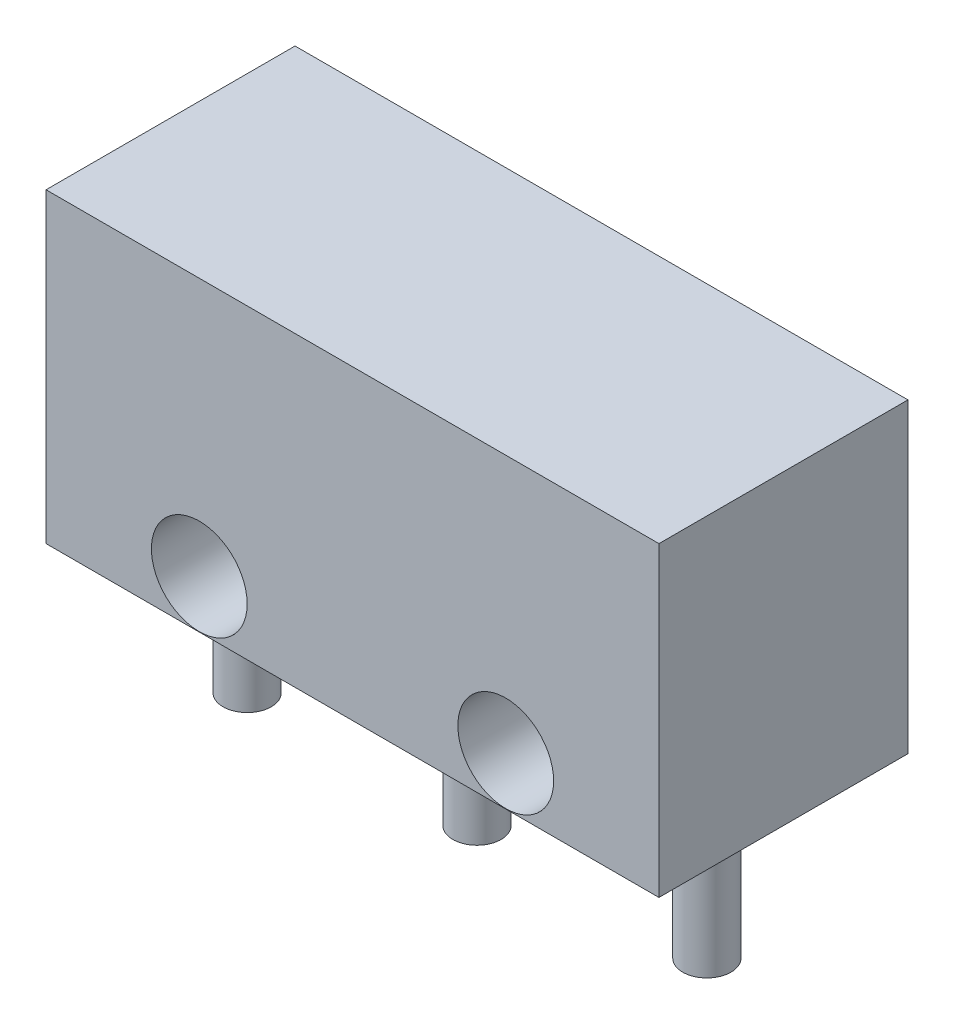
ISO-10303-21;
HEADER;
FILE_DESCRIPTION(('STEP AP214'),'2;1');
FILE_NAME('part.step','',(''),(''),'','','');
FILE_SCHEMA(('AUTOMOTIVE_DESIGN { 1 0 10303 214 1 1 1 1 }'));
ENDSEC;
DATA;
#1=APPLICATION_CONTEXT('core data for automotive mechanical design processes');
#2=APPLICATION_PROTOCOL_DEFINITION('international standard','automotive_design',2000,#1);
#3=PRODUCT_CONTEXT('',#1,'mechanical');
#4=PRODUCT('Part','Part','',(#3));
#5=PRODUCT_RELATED_PRODUCT_CATEGORY('part','',(#4));
#6=PRODUCT_DEFINITION_FORMATION('','',#4);
#7=PRODUCT_DEFINITION_CONTEXT('part definition',#1,'design');
#8=PRODUCT_DEFINITION('design','',#6,#7);
#9=PRODUCT_DEFINITION_SHAPE('','',#8);
#10=(LENGTH_UNIT() NAMED_UNIT(*) SI_UNIT(.MILLI.,.METRE.));
#11=(NAMED_UNIT(*) PLANE_ANGLE_UNIT() SI_UNIT($,.RADIAN.));
#12=(NAMED_UNIT(*) SI_UNIT($,.STERADIAN.) SOLID_ANGLE_UNIT());
#13=UNCERTAINTY_MEASURE_WITH_UNIT(LENGTH_MEASURE(1.E-05),#10,'distance_accuracy_value','');
#14=(GEOMETRIC_REPRESENTATION_CONTEXT(3) GLOBAL_UNCERTAINTY_ASSIGNED_CONTEXT((#13)) GLOBAL_UNIT_ASSIGNED_CONTEXT((#10,
#11,#12)) REPRESENTATION_CONTEXT('',''));
#15=CARTESIAN_POINT('',(0.,0.,0.));
#16=DIRECTION('',(0.,0.,1.));
#17=DIRECTION('',(1.,0.,0.));
#18=AXIS2_PLACEMENT_3D('',#15,#16,#17);
#19=CARTESIAN_POINT('',(0.,6.35,0.));
#20=DIRECTION('',(1.,0.,0.));
#21=DIRECTION('',(0.,0.,-1.));
#22=AXIS2_PLACEMENT_3D('',#19,#20,#21);
#23=PLANE('',#22);
#24=DIRECTION('',(0.,0.,1.));
#25=VECTOR('',#24,1.);
#26=CARTESIAN_POINT('',(0.,0.,0.));
#27=LINE('',#26,#25);
#28=CARTESIAN_POINT('',(0.,0.,-5.159375));
#29=VERTEX_POINT('',#28);
#30=CARTESIAN_POINT('',(0.,0.,0.));
#31=VERTEX_POINT('',#30);
#32=EDGE_CURVE('E96',#29,#31,#27,.T.);
#33=ORIENTED_EDGE('',*,*,#32,.T.);
#34=DIRECTION('',(0.,-1.,0.));
#35=VECTOR('',#34,1.);
#36=CARTESIAN_POINT('',(0.,6.35,0.));
#37=LINE('',#36,#35);
#38=CARTESIAN_POINT('',(0.,6.35,0.));
#39=VERTEX_POINT('',#38);
#40=EDGE_CURVE('E11',#39,#31,#37,.T.);
#41=ORIENTED_EDGE('',*,*,#40,.F.);
#42=DIRECTION('',(0.,0.,1.));
#43=VECTOR('',#42,1.);
#44=CARTESIAN_POINT('',(0.,6.35,0.));
#45=LINE('',#44,#43);
#46=CARTESIAN_POINT('',(0.,6.35,-5.159375));
#47=VERTEX_POINT('',#46);
#48=EDGE_CURVE('E84',#47,#39,#45,.T.);
#49=ORIENTED_EDGE('',*,*,#48,.F.);
#50=DIRECTION('',(0.,-1.,0.));
#51=VECTOR('',#50,1.);
#52=CARTESIAN_POINT('',(0.,6.35,-5.159375));
#53=LINE('',#52,#51);
#54=EDGE_CURVE('E92',#47,#29,#53,.T.);
#55=ORIENTED_EDGE('',*,*,#54,.T.);
#56=EDGE_LOOP('',(#33,#41,#49,#55));
#57=FACE_BOUND('',#56,.T.);
#58=ADVANCED_FACE('F33',(#57),#23,.F.);
#59=CARTESIAN_POINT('',(0.,6.35,0.));
#60=DIRECTION('',(0.,0.,-1.));
#61=DIRECTION('',(-1.,0.,0.));
#62=AXIS2_PLACEMENT_3D('',#59,#60,#61);
#63=PLANE('',#62);
#64=CARTESIAN_POINT('',(3.175,1.,0.));
#65=DIRECTION('',(0.,0.,1.));
#66=DIRECTION('',(1.,0.,0.));
#67=AXIS2_PLACEMENT_3D('',#64,#65,#66);
#68=CIRCLE('',#67,0.9921875);
#69=CARTESIAN_POINT('',(4.1671875,1.,0.));
#70=VERTEX_POINT('',#69);
#71=EDGE_CURVE('E134',#70,#70,#68,.T.);
#72=ORIENTED_EDGE('',*,*,#71,.F.);
#73=EDGE_LOOP('',(#72));
#74=FACE_BOUND('',#73,.T.);
#75=CARTESIAN_POINT('',(9.525,1.,0.));
#76=DIRECTION('',(0.,0.,1.));
#77=DIRECTION('',(1.,0.,0.));
#78=AXIS2_PLACEMENT_3D('',#75,#76,#77);
#79=CIRCLE('',#78,0.992187499999999);
#80=CARTESIAN_POINT('',(10.5171875,1.,0.));
#81=VERTEX_POINT('',#80);
#82=EDGE_CURVE('E128',#81,#81,#79,.T.);
#83=ORIENTED_EDGE('',*,*,#82,.F.);
#84=EDGE_LOOP('',(#83));
#85=FACE_BOUND('',#84,.T.);
#86=DIRECTION('',(1.,0.,0.));
#87=VECTOR('',#86,1.);
#88=CARTESIAN_POINT('',(0.,0.,0.));
#89=LINE('',#88,#87);
#90=CARTESIAN_POINT('',(12.7,0.,0.));
#91=VERTEX_POINT('',#90);
#92=EDGE_CURVE('E88',#31,#91,#89,.T.);
#93=ORIENTED_EDGE('',*,*,#92,.T.);
#94=DIRECTION('',(0.,-1.,0.));
#95=VECTOR('',#94,1.);
#96=CARTESIAN_POINT('',(12.7,6.35,0.));
#97=LINE('',#96,#95);
#98=CARTESIAN_POINT('',(12.7,6.35,0.));
#99=VERTEX_POINT('',#98);
#100=EDGE_CURVE('E41',#99,#91,#97,.T.);
#101=ORIENTED_EDGE('',*,*,#100,.F.);
#102=DIRECTION('',(1.,0.,0.));
#103=VECTOR('',#102,1.);
#104=CARTESIAN_POINT('',(0.,6.35,0.));
#105=LINE('',#104,#103);
#106=EDGE_CURVE('E79',#39,#99,#105,.T.);
#107=ORIENTED_EDGE('',*,*,#106,.F.);
#108=ORIENTED_EDGE('',*,*,#40,.T.);
#109=EDGE_LOOP('',(#93,#101,#107,#108));
#110=FACE_BOUND('',#109,.T.);
#111=ADVANCED_FACE('F87',(#74,#85,#110),#63,.F.);
#112=CARTESIAN_POINT('',(12.7,6.35,0.));
#113=DIRECTION('',(-1.,0.,0.));
#114=DIRECTION('',(0.,0.,1.));
#115=AXIS2_PLACEMENT_3D('',#112,#113,#114);
#116=PLANE('',#115);
#117=DIRECTION('',(0.,0.,-1.));
#118=VECTOR('',#117,1.);
#119=CARTESIAN_POINT('',(12.7,0.,0.));
#120=LINE('',#119,#118);
#121=CARTESIAN_POINT('',(12.7,0.,-5.159375));
#122=VERTEX_POINT('',#121);
#123=EDGE_CURVE('E66',#91,#122,#120,.T.);
#124=ORIENTED_EDGE('',*,*,#123,.T.);
#125=DIRECTION('',(0.,-1.,0.));
#126=VECTOR('',#125,1.);
#127=CARTESIAN_POINT('',(12.7,6.35,-5.159375));
#128=LINE('',#127,#126);
#129=CARTESIAN_POINT('',(12.7,6.35,-5.159375));
#130=VERTEX_POINT('',#129);
#131=EDGE_CURVE('E89',#130,#122,#128,.T.);
#132=ORIENTED_EDGE('',*,*,#131,.F.);
#133=DIRECTION('',(0.,0.,-1.));
#134=VECTOR('',#133,1.);
#135=CARTESIAN_POINT('',(12.7,6.35,0.));
#136=LINE('',#135,#134);
#137=EDGE_CURVE('E82',#99,#130,#136,.T.);
#138=ORIENTED_EDGE('',*,*,#137,.F.);
#139=ORIENTED_EDGE('',*,*,#100,.T.);
#140=EDGE_LOOP('',(#124,#132,#138,#139));
#141=FACE_BOUND('',#140,.T.);
#142=ADVANCED_FACE('F90',(#141),#116,.F.);
#143=CARTESIAN_POINT('',(0.,6.35,-5.159375));
#144=DIRECTION('',(0.,0.,1.));
#145=DIRECTION('',(1.,0.,0.));
#146=AXIS2_PLACEMENT_3D('',#143,#144,#145);
#147=PLANE('',#146);
#148=CARTESIAN_POINT('',(3.175,1.,-5.159375));
#149=DIRECTION('',(0.,0.,1.));
#150=DIRECTION('',(1.,0.,0.));
#151=AXIS2_PLACEMENT_3D('',#148,#149,#150);
#152=CIRCLE('',#151,0.9921875);
#153=CARTESIAN_POINT('',(4.1671875,1.,-5.159375));
#154=VERTEX_POINT('',#153);
#155=EDGE_CURVE('E131',#154,#154,#152,.T.);
#156=ORIENTED_EDGE('',*,*,#155,.T.);
#157=EDGE_LOOP('',(#156));
#158=FACE_BOUND('',#157,.T.);
#159=CARTESIAN_POINT('',(9.525,1.,-5.159375));
#160=DIRECTION('',(0.,0.,1.));
#161=DIRECTION('',(1.,0.,0.));
#162=AXIS2_PLACEMENT_3D('',#159,#160,#161);
#163=CIRCLE('',#162,0.992187499999999);
#164=CARTESIAN_POINT('',(10.5171875,1.,-5.159375));
#165=VERTEX_POINT('',#164);
#166=EDGE_CURVE('E125',#165,#165,#163,.T.);
#167=ORIENTED_EDGE('',*,*,#166,.T.);
#168=EDGE_LOOP('',(#167));
#169=FACE_BOUND('',#168,.T.);
#170=DIRECTION('',(-1.,0.,0.));
#171=VECTOR('',#170,1.);
#172=CARTESIAN_POINT('',(0.,0.,-5.159375));
#173=LINE('',#172,#171);
#174=EDGE_CURVE('E72',#122,#29,#173,.T.);
#175=ORIENTED_EDGE('',*,*,#174,.T.);
#176=ORIENTED_EDGE('',*,*,#54,.F.);
#177=DIRECTION('',(-1.,0.,0.));
#178=VECTOR('',#177,1.);
#179=CARTESIAN_POINT('',(0.,6.35,-5.159375));
#180=LINE('',#179,#178);
#181=EDGE_CURVE('E49',#130,#47,#180,.T.);
#182=ORIENTED_EDGE('',*,*,#181,.F.);
#183=ORIENTED_EDGE('',*,*,#131,.T.);
#184=EDGE_LOOP('',(#175,#176,#182,#183));
#185=FACE_BOUND('',#184,.T.);
#186=ADVANCED_FACE('F104',(#158,#169,#185),#147,.F.);
#187=CARTESIAN_POINT('',(0.,6.35,0.));
#188=DIRECTION('',(0.,-1.,0.));
#189=DIRECTION('',(0.,0.,-1.));
#190=AXIS2_PLACEMENT_3D('',#187,#188,#189);
#191=PLANE('',#190);
#192=ORIENTED_EDGE('',*,*,#48,.T.);
#193=ORIENTED_EDGE('',*,*,#106,.T.);
#194=ORIENTED_EDGE('',*,*,#137,.T.);
#195=ORIENTED_EDGE('',*,*,#181,.T.);
#196=EDGE_LOOP('',(#192,#193,#194,#195));
#197=FACE_BOUND('',#196,.T.);
#198=ADVANCED_FACE('F80',(#197),#191,.F.);
#199=CARTESIAN_POINT('',(0.,0.,0.));
#200=DIRECTION('',(0.,-1.,0.));
#201=DIRECTION('',(0.,0.,-1.));
#202=AXIS2_PLACEMENT_3D('',#199,#200,#201);
#203=PLANE('',#202);
#204=CARTESIAN_POINT('',(11.1125,0.,-2.5796875));
#205=DIRECTION('',(0.,-1.,0.));
#206=DIRECTION('',(0.,0.,-1.));
#207=AXIS2_PLACEMENT_3D('',#204,#205,#206);
#208=CIRCLE('',#207,0.500000000000001);
#209=CARTESIAN_POINT('',(11.1125,0.,-3.0796875));
#210=VERTEX_POINT('',#209);
#211=EDGE_CURVE('E122',#210,#210,#208,.T.);
#212=ORIENTED_EDGE('',*,*,#211,.F.);
#213=EDGE_LOOP('',(#212));
#214=FACE_BOUND('',#213,.T.);
#215=CARTESIAN_POINT('',(1.5875,0.,-2.5796875));
#216=DIRECTION('',(0.,-1.,0.));
#217=DIRECTION('',(0.,0.,-1.));
#218=AXIS2_PLACEMENT_3D('',#215,#216,#217);
#219=CIRCLE('',#218,0.5);
#220=CARTESIAN_POINT('',(1.5875,0.,-3.0796875));
#221=VERTEX_POINT('',#220);
#222=EDGE_CURVE('E116',#221,#221,#219,.T.);
#223=ORIENTED_EDGE('',*,*,#222,.F.);
#224=EDGE_LOOP('',(#223));
#225=FACE_BOUND('',#224,.T.);
#226=CARTESIAN_POINT('',(6.35,0.,-2.5796875));
#227=DIRECTION('',(0.,-1.,0.));
#228=DIRECTION('',(0.,0.,-1.));
#229=AXIS2_PLACEMENT_3D('',#226,#227,#228);
#230=CIRCLE('',#229,0.500000000000001);
#231=CARTESIAN_POINT('',(6.35,0.,-3.0796875));
#232=VERTEX_POINT('',#231);
#233=EDGE_CURVE('E110',#232,#232,#230,.T.);
#234=ORIENTED_EDGE('',*,*,#233,.F.);
#235=EDGE_LOOP('',(#234));
#236=FACE_BOUND('',#235,.T.);
#237=ORIENTED_EDGE('',*,*,#32,.F.);
#238=ORIENTED_EDGE('',*,*,#174,.F.);
#239=ORIENTED_EDGE('',*,*,#123,.F.);
#240=ORIENTED_EDGE('',*,*,#92,.F.);
#241=EDGE_LOOP('',(#237,#238,#239,#240));
#242=FACE_BOUND('',#241,.T.);
#243=ADVANCED_FACE('F107',(#214,#225,#236,#242),#203,.T.);
#244=CARTESIAN_POINT('',(6.35,-3.175,-2.5796875));
#245=DIRECTION('',(0.,1.,0.));
#246=DIRECTION('',(0.,0.,1.));
#247=AXIS2_PLACEMENT_3D('',#244,#245,#246);
#248=CYLINDRICAL_SURFACE('',#247,0.500000000000001);
#249=CARTESIAN_POINT('',(6.35,-3.175,-2.5796875));
#250=DIRECTION('',(0.,-1.,0.));
#251=DIRECTION('',(0.,0.,-1.));
#252=AXIS2_PLACEMENT_3D('',#249,#250,#251);
#253=CIRCLE('',#252,0.500000000000001);
#254=CARTESIAN_POINT('',(6.35,-3.175,-3.0796875));
#255=VERTEX_POINT('',#254);
#256=EDGE_CURVE('E99',#255,#255,#253,.T.);
#257=ORIENTED_EDGE('',*,*,#256,.F.);
#258=EDGE_LOOP('',(#257));
#259=FACE_BOUND('',#258,.T.);
#260=ORIENTED_EDGE('',*,*,#233,.T.);
#261=EDGE_LOOP('',(#260));
#262=FACE_BOUND('',#261,.T.);
#263=ADVANCED_FACE('F196',(#259,#262),#248,.T.);
#264=CARTESIAN_POINT('',(6.35,-3.175,-2.5796875));
#265=DIRECTION('',(0.,-1.,0.));
#266=DIRECTION('',(0.,0.,-1.));
#267=AXIS2_PLACEMENT_3D('',#264,#265,#266);
#268=PLANE('',#267);
#269=ORIENTED_EDGE('',*,*,#256,.T.);
#270=EDGE_LOOP('',(#269));
#271=FACE_BOUND('',#270,.T.);
#272=ADVANCED_FACE('F204',(#271),#268,.T.);
#273=CARTESIAN_POINT('',(1.5875,-3.175,-2.5796875));
#274=DIRECTION('',(0.,1.,0.));
#275=DIRECTION('',(0.,0.,1.));
#276=AXIS2_PLACEMENT_3D('',#273,#274,#275);
#277=CYLINDRICAL_SURFACE('',#276,0.5);
#278=CARTESIAN_POINT('',(1.5875,-3.175,-2.5796875));
#279=DIRECTION('',(0.,-1.,0.));
#280=DIRECTION('',(0.,0.,-1.));
#281=AXIS2_PLACEMENT_3D('',#278,#279,#280);
#282=CIRCLE('',#281,0.5);
#283=CARTESIAN_POINT('',(1.5875,-3.175,-3.0796875));
#284=VERTEX_POINT('',#283);
#285=EDGE_CURVE('E113',#284,#284,#282,.T.);
#286=ORIENTED_EDGE('',*,*,#285,.F.);
#287=EDGE_LOOP('',(#286));
#288=FACE_BOUND('',#287,.T.);
#289=ORIENTED_EDGE('',*,*,#222,.T.);
#290=EDGE_LOOP('',(#289));
#291=FACE_BOUND('',#290,.T.);
#292=ADVANCED_FACE('F212',(#288,#291),#277,.T.);
#293=CARTESIAN_POINT('',(1.5875,-3.175,-2.5796875));
#294=DIRECTION('',(0.,-1.,0.));
#295=DIRECTION('',(0.,0.,-1.));
#296=AXIS2_PLACEMENT_3D('',#293,#294,#295);
#297=PLANE('',#296);
#298=ORIENTED_EDGE('',*,*,#285,.T.);
#299=EDGE_LOOP('',(#298));
#300=FACE_BOUND('',#299,.T.);
#301=ADVANCED_FACE('F220',(#300),#297,.T.);
#302=CARTESIAN_POINT('',(11.1125,-3.175,-2.5796875));
#303=DIRECTION('',(0.,1.,0.));
#304=DIRECTION('',(0.,0.,1.));
#305=AXIS2_PLACEMENT_3D('',#302,#303,#304);
#306=CYLINDRICAL_SURFACE('',#305,0.500000000000001);
#307=CARTESIAN_POINT('',(11.1125,-3.175,-2.5796875));
#308=DIRECTION('',(0.,-1.,0.));
#309=DIRECTION('',(0.,0.,-1.));
#310=AXIS2_PLACEMENT_3D('',#307,#308,#309);
#311=CIRCLE('',#310,0.500000000000001);
#312=CARTESIAN_POINT('',(11.1125,-3.175,-3.0796875));
#313=VERTEX_POINT('',#312);
#314=EDGE_CURVE('E119',#313,#313,#311,.T.);
#315=ORIENTED_EDGE('',*,*,#314,.F.);
#316=EDGE_LOOP('',(#315));
#317=FACE_BOUND('',#316,.T.);
#318=ORIENTED_EDGE('',*,*,#211,.T.);
#319=EDGE_LOOP('',(#318));
#320=FACE_BOUND('',#319,.T.);
#321=ADVANCED_FACE('F160',(#317,#320),#306,.T.);
#322=CARTESIAN_POINT('',(11.1125,-3.175,-2.5796875));
#323=DIRECTION('',(0.,-1.,0.));
#324=DIRECTION('',(0.,0.,-1.));
#325=AXIS2_PLACEMENT_3D('',#322,#323,#324);
#326=PLANE('',#325);
#327=ORIENTED_EDGE('',*,*,#314,.T.);
#328=EDGE_LOOP('',(#327));
#329=FACE_BOUND('',#328,.T.);
#330=ADVANCED_FACE('F154',(#329),#326,.T.);
#331=CARTESIAN_POINT('',(9.525,1.,-5.159375));
#332=DIRECTION('',(0.,0.,1.));
#333=DIRECTION('',(1.,0.,0.));
#334=AXIS2_PLACEMENT_3D('',#331,#332,#333);
#335=CYLINDRICAL_SURFACE('',#334,0.992187499999999);
#336=ORIENTED_EDGE('',*,*,#166,.F.);
#337=EDGE_LOOP('',(#336));
#338=FACE_BOUND('',#337,.T.);
#339=ORIENTED_EDGE('',*,*,#82,.T.);
#340=EDGE_LOOP('',(#339));
#341=FACE_BOUND('',#340,.T.);
#342=ADVANCED_FACE('F145',(#338,#341),#335,.F.);
#343=CARTESIAN_POINT('',(3.175,1.,-5.159375));
#344=DIRECTION('',(0.,0.,1.));
#345=DIRECTION('',(1.,0.,0.));
#346=AXIS2_PLACEMENT_3D('',#343,#344,#345);
#347=CYLINDRICAL_SURFACE('',#346,0.9921875);
#348=ORIENTED_EDGE('',*,*,#155,.F.);
#349=EDGE_LOOP('',(#348));
#350=FACE_BOUND('',#349,.T.);
#351=ORIENTED_EDGE('',*,*,#71,.T.);
#352=EDGE_LOOP('',(#351));
#353=FACE_BOUND('',#352,.T.);
#354=ADVANCED_FACE('F142',(#350,#353),#347,.F.);
#355=CLOSED_SHELL('',(#58,#111,#142,#186,#198,#243,#263,#272,#292,#301,#321,#330,#342,#354));
#356=MANIFOLD_SOLID_BREP('B2',#355);
#357=ADVANCED_BREP_SHAPE_REPRESENTATION('',(#18,#356),#14);
#358=SHAPE_DEFINITION_REPRESENTATION(#9,#357);
ENDSEC;
END-ISO-10303-21;
